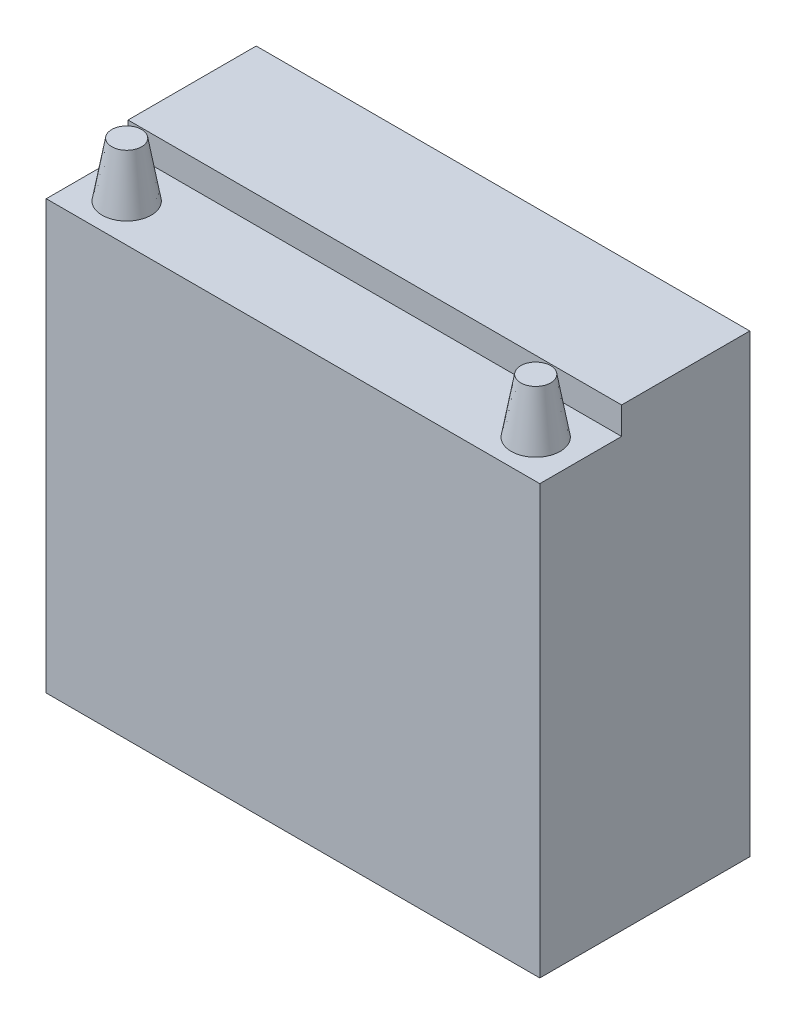
ISO-10303-21;
HEADER;
FILE_DESCRIPTION(('STEP AP214'),'2;1');
FILE_NAME('part.step','',(''),(''),'','','');
FILE_SCHEMA(('AUTOMOTIVE_DESIGN { 1 0 10303 214 1 1 1 1 }'));
ENDSEC;
DATA;
#1=APPLICATION_CONTEXT('core data for automotive mechanical design processes');
#2=APPLICATION_PROTOCOL_DEFINITION('international standard','automotive_design',2000,#1);
#3=PRODUCT_CONTEXT('',#1,'mechanical');
#4=PRODUCT('Part','Part','',(#3));
#5=PRODUCT_RELATED_PRODUCT_CATEGORY('part','',(#4));
#6=PRODUCT_DEFINITION_FORMATION('','',#4);
#7=PRODUCT_DEFINITION_CONTEXT('part definition',#1,'design');
#8=PRODUCT_DEFINITION('design','',#6,#7);
#9=PRODUCT_DEFINITION_SHAPE('','',#8);
#10=(LENGTH_UNIT() NAMED_UNIT(*) SI_UNIT(.MILLI.,.METRE.));
#11=(NAMED_UNIT(*) PLANE_ANGLE_UNIT() SI_UNIT($,.RADIAN.));
#12=(NAMED_UNIT(*) SI_UNIT($,.STERADIAN.) SOLID_ANGLE_UNIT());
#13=UNCERTAINTY_MEASURE_WITH_UNIT(LENGTH_MEASURE(1.E-05),#10,'distance_accuracy_value','');
#14=(GEOMETRIC_REPRESENTATION_CONTEXT(3) GLOBAL_UNCERTAINTY_ASSIGNED_CONTEXT((#13)) GLOBAL_UNIT_ASSIGNED_CONTEXT((#10,
#11,#12)) REPRESENTATION_CONTEXT('',''));
#15=CARTESIAN_POINT('',(0.,0.,0.));
#16=DIRECTION('',(0.,0.,1.));
#17=DIRECTION('',(1.,0.,0.));
#18=AXIS2_PLACEMENT_3D('',#15,#16,#17);
#19=CARTESIAN_POINT('',(104.,0.,31.830708661));
#20=DIRECTION('',(0.,-1.,0.));
#21=DIRECTION('',(0.,0.,-1.));
#22=AXIS2_PLACEMENT_3D('',#19,#20,#21);
#23=PLANE('',#22);
#24=DIRECTION('',(-1.,0.,0.));
#25=VECTOR('',#24,1.);
#26=CARTESIAN_POINT('',(104.,0.,-45.169291339));
#27=LINE('',#26,#25);
#28=CARTESIAN_POINT('',(104.,0.,-45.169291339));
#29=VERTEX_POINT('',#28);
#30=CARTESIAN_POINT('',(-77.,0.,-45.169291339));
#31=VERTEX_POINT('',#30);
#32=EDGE_CURVE('E83',#29,#31,#27,.T.);
#33=ORIENTED_EDGE('',*,*,#32,.F.);
#34=DIRECTION('',(0.,0.,-1.));
#35=VECTOR('',#34,1.);
#36=CARTESIAN_POINT('',(104.,0.,31.830708661));
#37=LINE('',#36,#35);
#38=CARTESIAN_POINT('',(104.,0.,31.830708661));
#39=VERTEX_POINT('',#38);
#40=EDGE_CURVE('E11',#39,#29,#37,.T.);
#41=ORIENTED_EDGE('',*,*,#40,.F.);
#42=DIRECTION('',(-1.,0.,0.));
#43=VECTOR('',#42,1.);
#44=CARTESIAN_POINT('',(104.,0.,31.830708661));
#45=LINE('',#44,#43);
#46=CARTESIAN_POINT('',(-77.,0.,31.830708661));
#47=VERTEX_POINT('',#46);
#48=EDGE_CURVE('E94',#39,#47,#45,.T.);
#49=ORIENTED_EDGE('',*,*,#48,.T.);
#50=DIRECTION('',(0.,0.,-1.));
#51=VECTOR('',#50,1.);
#52=CARTESIAN_POINT('',(-77.,0.,31.830708661));
#53=LINE('',#52,#51);
#54=EDGE_CURVE('E36',#47,#31,#53,.T.);
#55=ORIENTED_EDGE('',*,*,#54,.T.);
#56=EDGE_LOOP('',(#33,#41,#49,#55));
#57=FACE_BOUND('',#56,.T.);
#58=ADVANCED_FACE('F33',(#57),#23,.T.);
#59=CARTESIAN_POINT('',(104.,167.,31.830708661));
#60=DIRECTION('',(1.,0.,0.));
#61=DIRECTION('',(0.,0.,-1.));
#62=AXIS2_PLACEMENT_3D('',#59,#60,#61);
#63=PLANE('',#62);
#64=DIRECTION('',(0.,0.,1.));
#65=VECTOR('',#64,1.);
#66=CARTESIAN_POINT('',(104.,156.99999998,1.8307086535));
#67=LINE('',#66,#65);
#68=CARTESIAN_POINT('',(104.,156.99999998,1.8307086535));
#69=VERTEX_POINT('',#68);
#70=CARTESIAN_POINT('',(104.,156.99999998,31.830708661));
#71=VERTEX_POINT('',#70);
#72=EDGE_CURVE('E121',#69,#71,#67,.T.);
#73=ORIENTED_EDGE('',*,*,#72,.T.);
#74=DIRECTION('',(0.,-1.,0.));
#75=VECTOR('',#74,1.);
#76=CARTESIAN_POINT('',(104.,167.,31.830708661));
#77=LINE('',#76,#75);
#78=EDGE_CURVE('E57',#71,#39,#77,.T.);
#79=ORIENTED_EDGE('',*,*,#78,.T.);
#80=ORIENTED_EDGE('',*,*,#40,.T.);
#81=DIRECTION('',(0.,-1.,0.));
#82=VECTOR('',#81,1.);
#83=CARTESIAN_POINT('',(104.,167.,-45.169291339));
#84=LINE('',#83,#82);
#85=CARTESIAN_POINT('',(104.,167.,-45.169291339));
#86=VERTEX_POINT('',#85);
#87=EDGE_CURVE('E78',#86,#29,#84,.T.);
#88=ORIENTED_EDGE('',*,*,#87,.F.);
#89=DIRECTION('',(0.,0.,-1.));
#90=VECTOR('',#89,1.);
#91=CARTESIAN_POINT('',(104.,167.,31.830708661));
#92=LINE('',#91,#90);
#93=CARTESIAN_POINT('',(104.,167.,1.8307086535));
#94=VERTEX_POINT('',#93);
#95=EDGE_CURVE('E41',#94,#86,#92,.T.);
#96=ORIENTED_EDGE('',*,*,#95,.F.);
#97=DIRECTION('',(0.,-1.,0.));
#98=VECTOR('',#97,1.);
#99=CARTESIAN_POINT('',(104.,167.,1.8307086535));
#100=LINE('',#99,#98);
#101=EDGE_CURVE('E127',#94,#69,#100,.T.);
#102=ORIENTED_EDGE('',*,*,#101,.T.);
#103=EDGE_LOOP('',(#73,#79,#80,#88,#96,#102));
#104=FACE_BOUND('',#103,.T.);
#105=ADVANCED_FACE('F75',(#104),#63,.T.);
#106=CARTESIAN_POINT('',(-77.,167.,31.830708661));
#107=DIRECTION('',(0.,1.,0.));
#108=DIRECTION('',(0.,0.,1.));
#109=AXIS2_PLACEMENT_3D('',#106,#107,#108);
#110=PLANE('',#109);
#111=DIRECTION('',(-1.,0.,0.));
#112=VECTOR('',#111,1.);
#113=CARTESIAN_POINT('',(104.,167.,1.8307086535));
#114=LINE('',#113,#112);
#115=CARTESIAN_POINT('',(-77.,167.,1.8307086535));
#116=VERTEX_POINT('',#115);
#117=EDGE_CURVE('E115',#94,#116,#114,.T.);
#118=ORIENTED_EDGE('',*,*,#117,.F.);
#119=ORIENTED_EDGE('',*,*,#95,.T.);
#120=DIRECTION('',(1.,0.,0.));
#121=VECTOR('',#120,1.);
#122=CARTESIAN_POINT('',(-77.,167.,-45.169291339));
#123=LINE('',#122,#121);
#124=CARTESIAN_POINT('',(-77.,167.,-45.169291339));
#125=VERTEX_POINT('',#124);
#126=EDGE_CURVE('E93',#125,#86,#123,.T.);
#127=ORIENTED_EDGE('',*,*,#126,.F.);
#128=DIRECTION('',(0.,0.,-1.));
#129=VECTOR('',#128,1.);
#130=CARTESIAN_POINT('',(-77.,167.,31.830708661));
#131=LINE('',#130,#129);
#132=EDGE_CURVE('E101',#116,#125,#131,.T.);
#133=ORIENTED_EDGE('',*,*,#132,.F.);
#134=EDGE_LOOP('',(#118,#119,#127,#133));
#135=FACE_BOUND('',#134,.T.);
#136=ADVANCED_FACE('F169',(#135),#110,.T.);
#137=CARTESIAN_POINT('',(-77.,0.,31.830708661));
#138=DIRECTION('',(-1.,0.,0.));
#139=DIRECTION('',(0.,-1.,0.));
#140=AXIS2_PLACEMENT_3D('',#137,#138,#139);
#141=PLANE('',#140);
#142=DIRECTION('',(0.,0.,1.));
#143=VECTOR('',#142,1.);
#144=CARTESIAN_POINT('',(-77.,156.99999998,1.8307086535));
#145=LINE('',#144,#143);
#146=CARTESIAN_POINT('',(-77.,156.99999998,1.8307086535));
#147=VERTEX_POINT('',#146);
#148=CARTESIAN_POINT('',(-77.,156.99999998,31.830708661));
#149=VERTEX_POINT('',#148);
#150=EDGE_CURVE('E49',#147,#149,#145,.T.);
#151=ORIENTED_EDGE('',*,*,#150,.F.);
#152=DIRECTION('',(0.,-1.,0.));
#153=VECTOR('',#152,1.);
#154=CARTESIAN_POINT('',(-77.,167.,1.8307086535));
#155=LINE('',#154,#153);
#156=EDGE_CURVE('E132',#116,#147,#155,.T.);
#157=ORIENTED_EDGE('',*,*,#156,.F.);
#158=ORIENTED_EDGE('',*,*,#132,.T.);
#159=DIRECTION('',(0.,1.,0.));
#160=VECTOR('',#159,1.);
#161=CARTESIAN_POINT('',(-77.,0.,-45.169291339));
#162=LINE('',#161,#160);
#163=EDGE_CURVE('E87',#31,#125,#162,.T.);
#164=ORIENTED_EDGE('',*,*,#163,.F.);
#165=ORIENTED_EDGE('',*,*,#54,.F.);
#166=DIRECTION('',(0.,1.,0.));
#167=VECTOR('',#166,1.);
#168=CARTESIAN_POINT('',(-77.,0.,31.830708661));
#169=LINE('',#168,#167);
#170=EDGE_CURVE('E96',#47,#149,#169,.T.);
#171=ORIENTED_EDGE('',*,*,#170,.T.);
#172=EDGE_LOOP('',(#151,#157,#158,#164,#165,#171));
#173=FACE_BOUND('',#172,.T.);
#174=ADVANCED_FACE('F108',(#173),#141,.T.);
#175=CARTESIAN_POINT('',(0.,0.,31.830708661));
#176=DIRECTION('',(0.,0.,-1.));
#177=DIRECTION('',(-1.,0.,0.));
#178=AXIS2_PLACEMENT_3D('',#175,#176,#177);
#179=PLANE('',#178);
#180=ORIENTED_EDGE('',*,*,#78,.F.);
#181=DIRECTION('',(-1.,0.,0.));
#182=VECTOR('',#181,1.);
#183=CARTESIAN_POINT('',(104.,156.99999998,31.830708661));
#184=LINE('',#183,#182);
#185=EDGE_CURVE('E88',#71,#149,#184,.T.);
#186=ORIENTED_EDGE('',*,*,#185,.T.);
#187=ORIENTED_EDGE('',*,*,#170,.F.);
#188=ORIENTED_EDGE('',*,*,#48,.F.);
#189=EDGE_LOOP('',(#180,#186,#187,#188));
#190=FACE_BOUND('',#189,.T.);
#191=ADVANCED_FACE('F111',(#190),#179,.F.);
#192=CARTESIAN_POINT('',(0.,0.,-45.169291339));
#193=DIRECTION('',(0.,0.,-1.));
#194=DIRECTION('',(-1.,0.,0.));
#195=AXIS2_PLACEMENT_3D('',#192,#193,#194);
#196=PLANE('',#195);
#197=ORIENTED_EDGE('',*,*,#32,.T.);
#198=ORIENTED_EDGE('',*,*,#163,.T.);
#199=ORIENTED_EDGE('',*,*,#126,.T.);
#200=ORIENTED_EDGE('',*,*,#87,.T.);
#201=EDGE_LOOP('',(#197,#198,#199,#200));
#202=FACE_BOUND('',#201,.T.);
#203=ADVANCED_FACE('F91',(#202),#196,.T.);
#204=CARTESIAN_POINT('',(104.,156.99999998,1.8307086535));
#205=DIRECTION('',(0.,-1.,0.));
#206=DIRECTION('',(1.,0.,0.));
#207=AXIS2_PLACEMENT_3D('',#204,#205,#206);
#208=PLANE('',#207);
#209=CARTESIAN_POINT('',(-61.5,157.,17.830708661));
#210=DIRECTION('',(0.,1.,0.));
#211=DIRECTION('',(0.,0.,1.));
#212=AXIS2_PLACEMENT_3D('',#209,#210,#211);
#213=CIRCLE('',#212,9.);
#214=CARTESIAN_POINT('',(-61.5,157.,26.830708661));
#215=VERTEX_POINT('',#214);
#216=EDGE_CURVE('E141',#215,#215,#213,.T.);
#217=ORIENTED_EDGE('',*,*,#216,.F.);
#218=EDGE_LOOP('',(#217));
#219=FACE_BOUND('',#218,.T.);
#220=CARTESIAN_POINT('',(88.5,157.,17.830708661));
#221=DIRECTION('',(0.,1.,0.));
#222=DIRECTION('',(0.,0.,1.));
#223=AXIS2_PLACEMENT_3D('',#220,#221,#222);
#224=CIRCLE('',#223,8.99999999999999);
#225=CARTESIAN_POINT('',(88.5,157.,26.830708661));
#226=VERTEX_POINT('',#225);
#227=EDGE_CURVE('E133',#226,#226,#224,.T.);
#228=ORIENTED_EDGE('',*,*,#227,.F.);
#229=EDGE_LOOP('',(#228));
#230=FACE_BOUND('',#229,.T.);
#231=ORIENTED_EDGE('',*,*,#150,.T.);
#232=ORIENTED_EDGE('',*,*,#185,.F.);
#233=ORIENTED_EDGE('',*,*,#72,.F.);
#234=DIRECTION('',(-1.,0.,0.));
#235=VECTOR('',#234,1.);
#236=CARTESIAN_POINT('',(104.,156.99999998,1.8307086535));
#237=LINE('',#236,#235);
#238=EDGE_CURVE('E113',#69,#147,#237,.T.);
#239=ORIENTED_EDGE('',*,*,#238,.T.);
#240=EDGE_LOOP('',(#231,#232,#233,#239));
#241=FACE_BOUND('',#240,.T.);
#242=ADVANCED_FACE('F185',(#219,#230,#241),#208,.F.);
#243=CARTESIAN_POINT('',(104.,167.,1.8307086535));
#244=DIRECTION('',(0.,0.,-1.));
#245=DIRECTION('',(0.,1.,0.));
#246=AXIS2_PLACEMENT_3D('',#243,#244,#245);
#247=PLANE('',#246);
#248=ORIENTED_EDGE('',*,*,#156,.T.);
#249=ORIENTED_EDGE('',*,*,#238,.F.);
#250=ORIENTED_EDGE('',*,*,#101,.F.);
#251=ORIENTED_EDGE('',*,*,#117,.T.);
#252=EDGE_LOOP('',(#248,#249,#250,#251));
#253=FACE_BOUND('',#252,.T.);
#254=ADVANCED_FACE('F187',(#253),#247,.F.);
#255=CARTESIAN_POINT('',(88.5,177.,17.830708661));
#256=DIRECTION('',(0.,-1.,0.));
#257=DIRECTION('',(0.,0.,-1.));
#258=AXIS2_PLACEMENT_3D('',#255,#256,#257);
#259=CONICAL_SURFACE('',#258,5.473460386,0.174532925191223);
#260=ORIENTED_EDGE('',*,*,#227,.T.);
#261=EDGE_LOOP('',(#260));
#262=FACE_BOUND('',#261,.T.);
#263=CARTESIAN_POINT('',(88.5,177.,17.830708661));
#264=DIRECTION('',(0.,1.,0.));
#265=DIRECTION('',(0.,0.,1.));
#266=AXIS2_PLACEMENT_3D('',#263,#264,#265);
#267=CIRCLE('',#266,5.473460386);
#268=CARTESIAN_POINT('',(88.5,177.,23.304169047));
#269=VERTEX_POINT('',#268);
#270=EDGE_CURVE('E137',#269,#269,#267,.T.);
#271=ORIENTED_EDGE('',*,*,#270,.F.);
#272=EDGE_LOOP('',(#271));
#273=FACE_BOUND('',#272,.T.);
#274=ADVANCED_FACE('F162',(#262,#273),#259,.T.);
#275=CARTESIAN_POINT('',(88.5,177.,17.830708661));
#276=DIRECTION('',(0.,1.,0.));
#277=DIRECTION('',(0.,0.,1.));
#278=AXIS2_PLACEMENT_3D('',#275,#276,#277);
#279=PLANE('',#278);
#280=ORIENTED_EDGE('',*,*,#270,.T.);
#281=EDGE_LOOP('',(#280));
#282=FACE_BOUND('',#281,.T.);
#283=ADVANCED_FACE('F154',(#282),#279,.T.);
#284=CARTESIAN_POINT('',(-61.5,177.,17.830708661));
#285=DIRECTION('',(0.,-1.,0.));
#286=DIRECTION('',(0.,0.,-1.));
#287=AXIS2_PLACEMENT_3D('',#284,#285,#286);
#288=CONICAL_SURFACE('',#287,5.47346038599999,0.174532925191223);
#289=ORIENTED_EDGE('',*,*,#216,.T.);
#290=EDGE_LOOP('',(#289));
#291=FACE_BOUND('',#290,.T.);
#292=CARTESIAN_POINT('',(-61.5,177.,17.830708661));
#293=DIRECTION('',(0.,1.,0.));
#294=DIRECTION('',(0.,0.,1.));
#295=AXIS2_PLACEMENT_3D('',#292,#293,#294);
#296=CIRCLE('',#295,5.47346038599999);
#297=CARTESIAN_POINT('',(-61.5,177.,23.304169047));
#298=VERTEX_POINT('',#297);
#299=EDGE_CURVE('E146',#298,#298,#296,.T.);
#300=ORIENTED_EDGE('',*,*,#299,.F.);
#301=EDGE_LOOP('',(#300));
#302=FACE_BOUND('',#301,.T.);
#303=ADVANCED_FACE('F152',(#291,#302),#288,.T.);
#304=CARTESIAN_POINT('',(-61.5,177.,17.830708661));
#305=DIRECTION('',(0.,1.,0.));
#306=DIRECTION('',(0.,0.,1.));
#307=AXIS2_PLACEMENT_3D('',#304,#305,#306);
#308=PLANE('',#307);
#309=ORIENTED_EDGE('',*,*,#299,.T.);
#310=EDGE_LOOP('',(#309));
#311=FACE_BOUND('',#310,.T.);
#312=ADVANCED_FACE('F150',(#311),#308,.T.);
#313=CLOSED_SHELL('',(#58,#105,#136,#174,#191,#203,#242,#254,#274,#283,#303,#312));
#314=MANIFOLD_SOLID_BREP('B2',#313);
#315=ADVANCED_BREP_SHAPE_REPRESENTATION('',(#18,#314),#14);
#316=SHAPE_DEFINITION_REPRESENTATION(#9,#315);
ENDSEC;
END-ISO-10303-21;
